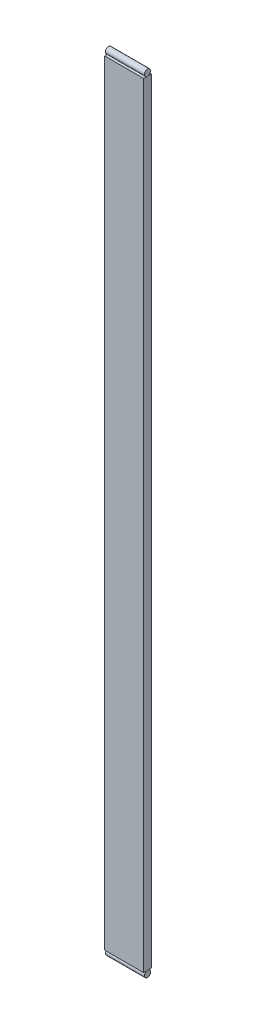
ISO-10303-21;
HEADER;
FILE_DESCRIPTION(('STEP AP214'),'2;1');
FILE_NAME('part.step','',(''),(''),'','','');
FILE_SCHEMA(('AUTOMOTIVE_DESIGN { 1 0 10303 214 1 1 1 1 }'));
ENDSEC;
DATA;
#1=APPLICATION_CONTEXT('core data for automotive mechanical design processes');
#2=APPLICATION_PROTOCOL_DEFINITION('international standard','automotive_design',2000,#1);
#3=PRODUCT_CONTEXT('',#1,'mechanical');
#4=PRODUCT('Part','Part','',(#3));
#5=PRODUCT_RELATED_PRODUCT_CATEGORY('part','',(#4));
#6=PRODUCT_DEFINITION_FORMATION('','',#4);
#7=PRODUCT_DEFINITION_CONTEXT('part definition',#1,'design');
#8=PRODUCT_DEFINITION('design','',#6,#7);
#9=PRODUCT_DEFINITION_SHAPE('','',#8);
#10=(LENGTH_UNIT() NAMED_UNIT(*) SI_UNIT(.MILLI.,.METRE.));
#11=(NAMED_UNIT(*) PLANE_ANGLE_UNIT() SI_UNIT($,.RADIAN.));
#12=(NAMED_UNIT(*) SI_UNIT($,.STERADIAN.) SOLID_ANGLE_UNIT());
#13=UNCERTAINTY_MEASURE_WITH_UNIT(LENGTH_MEASURE(1.E-05),#10,'distance_accuracy_value','');
#14=(GEOMETRIC_REPRESENTATION_CONTEXT(3) GLOBAL_UNCERTAINTY_ASSIGNED_CONTEXT((#13)) GLOBAL_UNIT_ASSIGNED_CONTEXT((#10,
#11,#12)) REPRESENTATION_CONTEXT('',''));
#15=CARTESIAN_POINT('',(0.,0.,0.));
#16=DIRECTION('',(0.,0.,1.));
#17=DIRECTION('',(1.,0.,0.));
#18=AXIS2_PLACEMENT_3D('',#15,#16,#17);
#19=CARTESIAN_POINT('',(-36.3137084989848,-4.,0.));
#20=DIRECTION('',(1.,0.,0.));
#21=DIRECTION('',(0.,0.,-1.));
#22=AXIS2_PLACEMENT_3D('',#19,#20,#21);
#23=CYLINDRICAL_SURFACE('',#22,4.);
#24=CARTESIAN_POINT('',(-25.,-4.,0.));
#25=DIRECTION('',(1.,0.,0.));
#26=DIRECTION('',(0.,0.,-1.));
#27=AXIS2_PLACEMENT_3D('',#24,#25,#26);
#28=CIRCLE('',#27,4.);
#29=CARTESIAN_POINT('',(-25.,-4.,-4.));
#30=VERTEX_POINT('',#29);
#31=EDGE_CURVE('E11',#30,#30,#28,.F.);
#32=ORIENTED_EDGE('',*,*,#31,.F.);
#33=EDGE_LOOP('',(#32));
#34=FACE_BOUND('',#33,.T.);
#35=CARTESIAN_POINT('',(25.,-4.,0.));
#36=DIRECTION('',(1.,0.,0.));
#37=DIRECTION('',(0.,0.,-1.));
#38=AXIS2_PLACEMENT_3D('',#35,#36,#37);
#39=CIRCLE('',#38,4.);
#40=CARTESIAN_POINT('',(25.,-4.,-4.));
#41=VERTEX_POINT('',#40);
#42=EDGE_CURVE('E50',#41,#41,#39,.T.);
#43=ORIENTED_EDGE('',*,*,#42,.F.);
#44=EDGE_LOOP('',(#43));
#45=FACE_BOUND('',#44,.T.);
#46=ADVANCED_FACE('F44',(#34,#45),#23,.T.);
#47=CARTESIAN_POINT('',(25.,-4.,0.));
#48=DIRECTION('',(1.,0.,0.));
#49=DIRECTION('',(0.,0.,-1.));
#50=AXIS2_PLACEMENT_3D('',#47,#48,#49);
#51=PLANE('',#50);
#52=ORIENTED_EDGE('',*,*,#42,.T.);
#53=EDGE_LOOP('',(#52));
#54=FACE_BOUND('',#53,.T.);
#55=ADVANCED_FACE('F56',(#54),#51,.T.);
#56=CARTESIAN_POINT('',(-25.,992.,5.));
#57=DIRECTION('',(1.,0.,0.));
#58=DIRECTION('',(0.,0.,-1.));
#59=AXIS2_PLACEMENT_3D('',#56,#57,#58);
#60=PLANE('',#59);
#61=ORIENTED_EDGE('',*,*,#31,.T.);
#62=EDGE_LOOP('',(#61));
#63=FACE_BOUND('',#62,.T.);
#64=ADVANCED_FACE('F63',(#63),#60,.F.);
#65=CLOSED_SHELL('',(#46,#55,#64));
#66=MANIFOLD_SOLID_BREP('B2',#65);
#67=CARTESIAN_POINT('',(-36.3137084989848,996.,0.));
#68=DIRECTION('',(1.,0.,0.));
#69=DIRECTION('',(0.,0.,-1.));
#70=AXIS2_PLACEMENT_3D('',#67,#68,#69);
#71=CYLINDRICAL_SURFACE('',#70,4.);
#72=CARTESIAN_POINT('',(-25.,996.,0.));
#73=DIRECTION('',(1.,0.,0.));
#74=DIRECTION('',(0.,0.,-1.));
#75=AXIS2_PLACEMENT_3D('',#72,#73,#74);
#76=CIRCLE('',#75,4.);
#77=CARTESIAN_POINT('',(-25.,996.,-4.));
#78=VERTEX_POINT('',#77);
#79=EDGE_CURVE('E43',#78,#78,#76,.F.);
#80=ORIENTED_EDGE('',*,*,#79,.F.);
#81=EDGE_LOOP('',(#80));
#82=FACE_BOUND('',#81,.T.);
#83=CARTESIAN_POINT('',(25.,996.,0.));
#84=DIRECTION('',(1.,0.,0.));
#85=DIRECTION('',(0.,0.,-1.));
#86=AXIS2_PLACEMENT_3D('',#83,#84,#85);
#87=CIRCLE('',#86,4.);
#88=CARTESIAN_POINT('',(25.,996.,-4.));
#89=VERTEX_POINT('',#88);
#90=EDGE_CURVE('E102',#89,#89,#87,.T.);
#91=ORIENTED_EDGE('',*,*,#90,.F.);
#92=EDGE_LOOP('',(#91));
#93=FACE_BOUND('',#92,.T.);
#94=ADVANCED_FACE('F96',(#82,#93),#71,.T.);
#95=CARTESIAN_POINT('',(25.,996.,0.));
#96=DIRECTION('',(1.,0.,0.));
#97=DIRECTION('',(0.,0.,-1.));
#98=AXIS2_PLACEMENT_3D('',#95,#96,#97);
#99=PLANE('',#98);
#100=ORIENTED_EDGE('',*,*,#90,.T.);
#101=EDGE_LOOP('',(#100));
#102=FACE_BOUND('',#101,.T.);
#103=ADVANCED_FACE('F108',(#102),#99,.T.);
#104=CARTESIAN_POINT('',(-25.,992.,5.));
#105=DIRECTION('',(1.,0.,0.));
#106=DIRECTION('',(0.,0.,-1.));
#107=AXIS2_PLACEMENT_3D('',#104,#105,#106);
#108=PLANE('',#107);
#109=ORIENTED_EDGE('',*,*,#79,.T.);
#110=EDGE_LOOP('',(#109));
#111=FACE_BOUND('',#110,.T.);
#112=ADVANCED_FACE('F115',(#111),#108,.F.);
#113=CLOSED_SHELL('',(#94,#103,#112));
#114=MANIFOLD_SOLID_BREP('B6',#113);
#115=CARTESIAN_POINT('',(25.,992.,5.));
#116=DIRECTION('',(-1.,0.,0.));
#117=DIRECTION('',(0.,0.,1.));
#118=AXIS2_PLACEMENT_3D('',#115,#116,#117);
#119=PLANE('',#118);
#120=DIRECTION('',(0.,0.,-1.));
#121=VECTOR('',#120,1.);
#122=CARTESIAN_POINT('',(25.,0.,5.));
#123=LINE('',#122,#121);
#124=CARTESIAN_POINT('',(25.,0.,5.));
#125=VERTEX_POINT('',#124);
#126=CARTESIAN_POINT('',(25.,0.,-5.));
#127=VERTEX_POINT('',#126);
#128=EDGE_CURVE('E201',#125,#127,#123,.T.);
#129=ORIENTED_EDGE('',*,*,#128,.T.);
#130=DIRECTION('',(0.,-1.,0.));
#131=VECTOR('',#130,1.);
#132=CARTESIAN_POINT('',(25.,992.,-5.));
#133=LINE('',#132,#131);
#134=CARTESIAN_POINT('',(25.,992.,-5.));
#135=VERTEX_POINT('',#134);
#136=EDGE_CURVE('E94',#135,#127,#133,.T.);
#137=ORIENTED_EDGE('',*,*,#136,.F.);
#138=DIRECTION('',(0.,0.,-1.));
#139=VECTOR('',#138,1.);
#140=CARTESIAN_POINT('',(25.,992.,5.));
#141=LINE('',#140,#139);
#142=CARTESIAN_POINT('',(25.,992.,5.));
#143=VERTEX_POINT('',#142);
#144=EDGE_CURVE('E189',#143,#135,#141,.T.);
#145=ORIENTED_EDGE('',*,*,#144,.F.);
#146=DIRECTION('',(0.,-1.,0.));
#147=VECTOR('',#146,1.);
#148=CARTESIAN_POINT('',(25.,992.,5.));
#149=LINE('',#148,#147);
#150=EDGE_CURVE('E197',#143,#125,#149,.T.);
#151=ORIENTED_EDGE('',*,*,#150,.T.);
#152=EDGE_LOOP('',(#129,#137,#145,#151));
#153=FACE_BOUND('',#152,.T.);
#154=ADVANCED_FACE('F138',(#153),#119,.F.);
#155=CARTESIAN_POINT('',(-25.,992.,-5.));
#156=DIRECTION('',(0.,0.,1.));
#157=DIRECTION('',(1.,0.,0.));
#158=AXIS2_PLACEMENT_3D('',#155,#156,#157);
#159=PLANE('',#158);
#160=DIRECTION('',(-1.,0.,0.));
#161=VECTOR('',#160,1.);
#162=CARTESIAN_POINT('',(-25.,0.,-5.));
#163=LINE('',#162,#161);
#164=CARTESIAN_POINT('',(-25.,0.,-5.));
#165=VERTEX_POINT('',#164);
#166=EDGE_CURVE('E193',#127,#165,#163,.T.);
#167=ORIENTED_EDGE('',*,*,#166,.T.);
#168=DIRECTION('',(0.,-1.,0.));
#169=VECTOR('',#168,1.);
#170=CARTESIAN_POINT('',(-25.,992.,-5.));
#171=LINE('',#170,#169);
#172=CARTESIAN_POINT('',(-25.,992.,-5.));
#173=VERTEX_POINT('',#172);
#174=EDGE_CURVE('E146',#173,#165,#171,.T.);
#175=ORIENTED_EDGE('',*,*,#174,.F.);
#176=DIRECTION('',(-1.,0.,0.));
#177=VECTOR('',#176,1.);
#178=CARTESIAN_POINT('',(-25.,992.,-5.));
#179=LINE('',#178,#177);
#180=EDGE_CURVE('E184',#135,#173,#179,.T.);
#181=ORIENTED_EDGE('',*,*,#180,.F.);
#182=ORIENTED_EDGE('',*,*,#136,.T.);
#183=EDGE_LOOP('',(#167,#175,#181,#182));
#184=FACE_BOUND('',#183,.T.);
#185=ADVANCED_FACE('F192',(#184),#159,.F.);
#186=CARTESIAN_POINT('',(-25.,992.,5.));
#187=DIRECTION('',(1.,0.,0.));
#188=DIRECTION('',(0.,0.,-1.));
#189=AXIS2_PLACEMENT_3D('',#186,#187,#188);
#190=PLANE('',#189);
#191=DIRECTION('',(0.,0.,1.));
#192=VECTOR('',#191,1.);
#193=CARTESIAN_POINT('',(-25.,0.,5.));
#194=LINE('',#193,#192);
#195=CARTESIAN_POINT('',(-25.,0.,5.));
#196=VERTEX_POINT('',#195);
#197=EDGE_CURVE('E171',#165,#196,#194,.T.);
#198=ORIENTED_EDGE('',*,*,#197,.T.);
#199=DIRECTION('',(0.,-1.,0.));
#200=VECTOR('',#199,1.);
#201=CARTESIAN_POINT('',(-25.,992.,5.));
#202=LINE('',#201,#200);
#203=CARTESIAN_POINT('',(-25.,992.,5.));
#204=VERTEX_POINT('',#203);
#205=EDGE_CURVE('E194',#204,#196,#202,.T.);
#206=ORIENTED_EDGE('',*,*,#205,.F.);
#207=DIRECTION('',(0.,0.,1.));
#208=VECTOR('',#207,1.);
#209=CARTESIAN_POINT('',(-25.,992.,5.));
#210=LINE('',#209,#208);
#211=EDGE_CURVE('E187',#173,#204,#210,.T.);
#212=ORIENTED_EDGE('',*,*,#211,.F.);
#213=ORIENTED_EDGE('',*,*,#174,.T.);
#214=EDGE_LOOP('',(#198,#206,#212,#213));
#215=FACE_BOUND('',#214,.T.);
#216=ADVANCED_FACE('F195',(#215),#190,.F.);
#217=CARTESIAN_POINT('',(-25.,992.,5.));
#218=DIRECTION('',(0.,0.,-1.));
#219=DIRECTION('',(-1.,0.,0.));
#220=AXIS2_PLACEMENT_3D('',#217,#218,#219);
#221=PLANE('',#220);
#222=DIRECTION('',(1.,0.,0.));
#223=VECTOR('',#222,1.);
#224=CARTESIAN_POINT('',(-25.,0.,5.));
#225=LINE('',#224,#223);
#226=EDGE_CURVE('E177',#196,#125,#225,.T.);
#227=ORIENTED_EDGE('',*,*,#226,.T.);
#228=ORIENTED_EDGE('',*,*,#150,.F.);
#229=DIRECTION('',(1.,0.,0.));
#230=VECTOR('',#229,1.);
#231=CARTESIAN_POINT('',(-25.,992.,5.));
#232=LINE('',#231,#230);
#233=EDGE_CURVE('E154',#204,#143,#232,.T.);
#234=ORIENTED_EDGE('',*,*,#233,.F.);
#235=ORIENTED_EDGE('',*,*,#205,.T.);
#236=EDGE_LOOP('',(#227,#228,#234,#235));
#237=FACE_BOUND('',#236,.T.);
#238=ADVANCED_FACE('F208',(#237),#221,.F.);
#239=CARTESIAN_POINT('',(0.,992.,0.));
#240=DIRECTION('',(0.,-1.,0.));
#241=DIRECTION('',(0.,0.,-1.));
#242=AXIS2_PLACEMENT_3D('',#239,#240,#241);
#243=PLANE('',#242);
#244=ORIENTED_EDGE('',*,*,#144,.T.);
#245=ORIENTED_EDGE('',*,*,#180,.T.);
#246=ORIENTED_EDGE('',*,*,#211,.T.);
#247=ORIENTED_EDGE('',*,*,#233,.T.);
#248=EDGE_LOOP('',(#244,#245,#246,#247));
#249=FACE_BOUND('',#248,.T.);
#250=ADVANCED_FACE('F185',(#249),#243,.F.);
#251=CARTESIAN_POINT('',(0.,0.,0.));
#252=DIRECTION('',(0.,-1.,0.));
#253=DIRECTION('',(0.,0.,-1.));
#254=AXIS2_PLACEMENT_3D('',#251,#252,#253);
#255=PLANE('',#254);
#256=ORIENTED_EDGE('',*,*,#128,.F.);
#257=ORIENTED_EDGE('',*,*,#226,.F.);
#258=ORIENTED_EDGE('',*,*,#197,.F.);
#259=ORIENTED_EDGE('',*,*,#166,.F.);
#260=EDGE_LOOP('',(#256,#257,#258,#259));
#261=FACE_BOUND('',#260,.T.);
#262=ADVANCED_FACE('F211',(#261),#255,.T.);
#263=CLOSED_SHELL('',(#154,#185,#216,#238,#250,#262));
#264=MANIFOLD_SOLID_BREP('B38',#263);
#265=ADVANCED_BREP_SHAPE_REPRESENTATION('',(#18,#66,#114,#264),#14);
#266=SHAPE_DEFINITION_REPRESENTATION(#9,#265);
ENDSEC;
END-ISO-10303-21;
